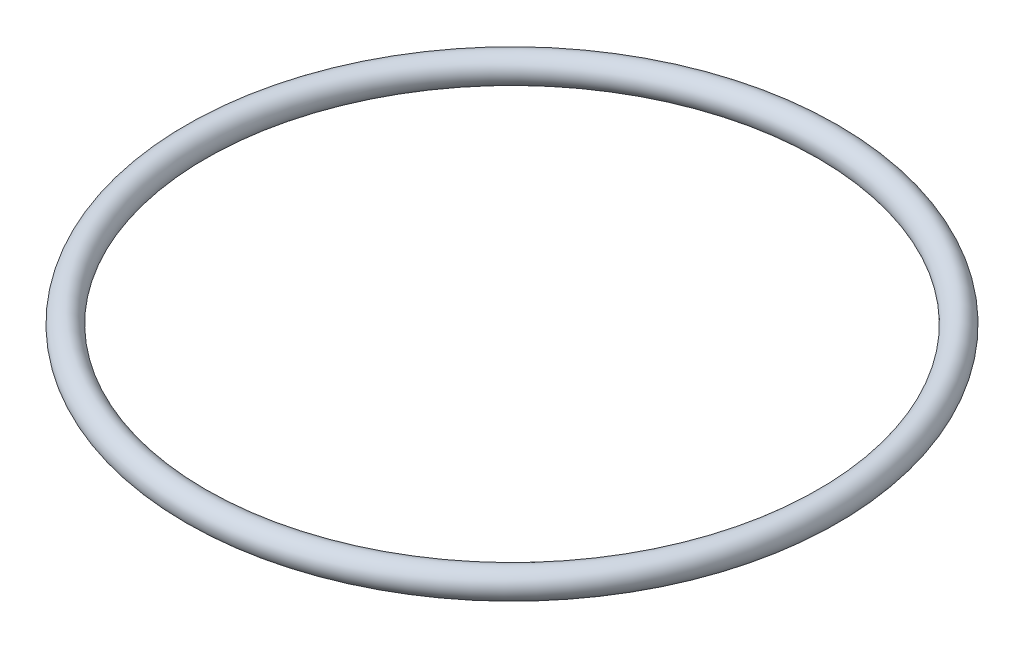
ISO-10303-21;
HEADER;
FILE_DESCRIPTION(('STEP AP214'),'2;1');
FILE_NAME('part.step','',(''),(''),'','','');
FILE_SCHEMA(('AUTOMOTIVE_DESIGN { 1 0 10303 214 1 1 1 1 }'));
ENDSEC;
DATA;
#1=APPLICATION_CONTEXT('core data for automotive mechanical design processes');
#2=APPLICATION_PROTOCOL_DEFINITION('international standard','automotive_design',2000,#1);
#3=PRODUCT_CONTEXT('',#1,'mechanical');
#4=PRODUCT('Part','Part','',(#3));
#5=PRODUCT_RELATED_PRODUCT_CATEGORY('part','',(#4));
#6=PRODUCT_DEFINITION_FORMATION('','',#4);
#7=PRODUCT_DEFINITION_CONTEXT('part definition',#1,'design');
#8=PRODUCT_DEFINITION('design','',#6,#7);
#9=PRODUCT_DEFINITION_SHAPE('','',#8);
#10=(LENGTH_UNIT() NAMED_UNIT(*) SI_UNIT(.MILLI.,.METRE.));
#11=(NAMED_UNIT(*) PLANE_ANGLE_UNIT() SI_UNIT($,.RADIAN.));
#12=(NAMED_UNIT(*) SI_UNIT($,.STERADIAN.) SOLID_ANGLE_UNIT());
#13=UNCERTAINTY_MEASURE_WITH_UNIT(LENGTH_MEASURE(1.E-05),#10,'distance_accuracy_value','');
#14=(GEOMETRIC_REPRESENTATION_CONTEXT(3) GLOBAL_UNCERTAINTY_ASSIGNED_CONTEXT((#13)) GLOBAL_UNIT_ASSIGNED_CONTEXT((#10,
#11,#12)) REPRESENTATION_CONTEXT('',''));
#15=CARTESIAN_POINT('',(0.,0.,0.));
#16=DIRECTION('',(0.,0.,1.));
#17=DIRECTION('',(1.,0.,0.));
#18=AXIS2_PLACEMENT_3D('',#15,#16,#17);
#19=CARTESIAN_POINT('',(0.,0.,0.));
#20=DIRECTION('',(0.,0.999999999999999,0.));
#21=DIRECTION('',(0.,0.,1.));
#22=AXIS2_PLACEMENT_3D('',#19,#20,#21);
#23=TOROIDAL_SURFACE('',#22,18.30705,0.793749999999999);
#24=CARTESIAN_POINT('',(0.,0.,19.1008));
#25=VERTEX_POINT('',#24);
#26=VERTEX_LOOP('',#25);
#27=FACE_BOUND('',#26,.T.);
#28=ADVANCED_FACE('F28',(#27),#23,.T.);
#29=CLOSED_SHELL('',(#28));
#30=MANIFOLD_SOLID_BREP('B2',#29);
#31=ADVANCED_BREP_SHAPE_REPRESENTATION('',(#18,#30),#14);
#32=SHAPE_DEFINITION_REPRESENTATION(#9,#31);
ENDSEC;
END-ISO-10303-21;
